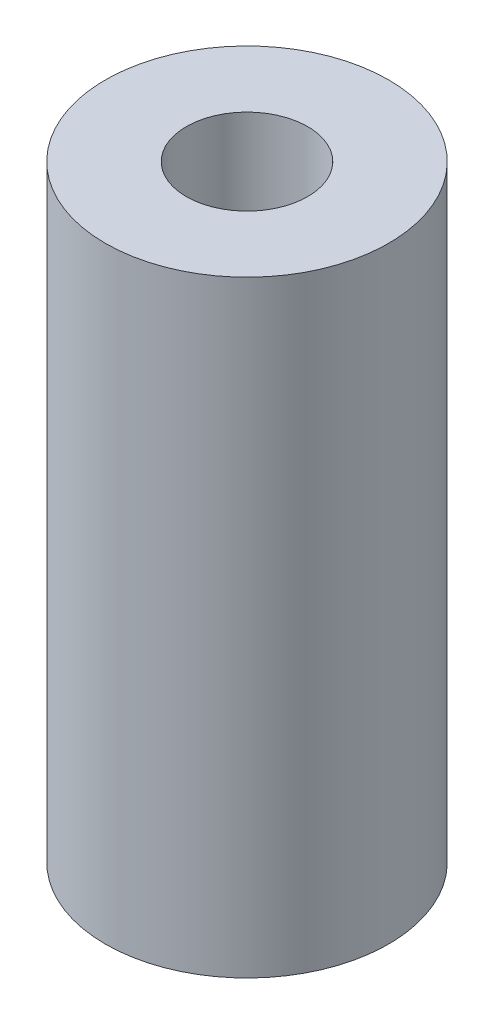
ISO-10303-21;
HEADER;
FILE_DESCRIPTION(('STEP AP214'),'2;1');
FILE_NAME('part.step','',(''),(''),'','','');
FILE_SCHEMA(('AUTOMOTIVE_DESIGN { 1 0 10303 214 1 1 1 1 }'));
ENDSEC;
DATA;
#1=APPLICATION_CONTEXT('core data for automotive mechanical design processes');
#2=APPLICATION_PROTOCOL_DEFINITION('international standard','automotive_design',2000,#1);
#3=PRODUCT_CONTEXT('',#1,'mechanical');
#4=PRODUCT('Part','Part','',(#3));
#5=PRODUCT_RELATED_PRODUCT_CATEGORY('part','',(#4));
#6=PRODUCT_DEFINITION_FORMATION('','',#4);
#7=PRODUCT_DEFINITION_CONTEXT('part definition',#1,'design');
#8=PRODUCT_DEFINITION('design','',#6,#7);
#9=PRODUCT_DEFINITION_SHAPE('','',#8);
#10=(LENGTH_UNIT() NAMED_UNIT(*) SI_UNIT(.MILLI.,.METRE.));
#11=(NAMED_UNIT(*) PLANE_ANGLE_UNIT() SI_UNIT($,.RADIAN.));
#12=(NAMED_UNIT(*) SI_UNIT($,.STERADIAN.) SOLID_ANGLE_UNIT());
#13=UNCERTAINTY_MEASURE_WITH_UNIT(LENGTH_MEASURE(1.E-05),#10,'distance_accuracy_value','');
#14=(GEOMETRIC_REPRESENTATION_CONTEXT(3) GLOBAL_UNCERTAINTY_ASSIGNED_CONTEXT((#13)) GLOBAL_UNIT_ASSIGNED_CONTEXT((#10,
#11,#12)) REPRESENTATION_CONTEXT('',''));
#15=CARTESIAN_POINT('',(0.,0.,0.));
#16=DIRECTION('',(0.,0.,1.));
#17=DIRECTION('',(1.,0.,0.));
#18=AXIS2_PLACEMENT_3D('',#15,#16,#17);
#19=CARTESIAN_POINT('',(0.,15.,0.));
#20=DIRECTION('',(0.,1.,0.));
#21=DIRECTION('',(0.,0.,1.));
#22=AXIS2_PLACEMENT_3D('',#19,#20,#21);
#23=PLANE('',#22);
#24=CARTESIAN_POINT('',(0.,15.,0.));
#25=DIRECTION('',(0.,1.,0.));
#26=DIRECTION('',(0.,0.,1.));
#27=AXIS2_PLACEMENT_3D('',#24,#25,#26);
#28=CIRCLE('',#27,3.5);
#29=CARTESIAN_POINT('',(0.,15.,3.5));
#30=VERTEX_POINT('',#29);
#31=EDGE_CURVE('E10',#30,#30,#28,.T.);
#32=ORIENTED_EDGE('',*,*,#31,.T.);
#33=EDGE_LOOP('',(#32));
#34=FACE_BOUND('',#33,.T.);
#35=CARTESIAN_POINT('',(0.,15.,0.));
#36=DIRECTION('',(0.,1.,0.));
#37=DIRECTION('',(0.,0.,1.));
#38=AXIS2_PLACEMENT_3D('',#35,#36,#37);
#39=CIRCLE('',#38,1.5);
#40=CARTESIAN_POINT('',(0.,15.,1.5));
#41=VERTEX_POINT('',#40);
#42=EDGE_CURVE('E42',#41,#41,#39,.T.);
#43=ORIENTED_EDGE('',*,*,#42,.F.);
#44=EDGE_LOOP('',(#43));
#45=FACE_BOUND('',#44,.T.);
#46=ADVANCED_FACE('F31',(#34,#45),#23,.T.);
#47=CARTESIAN_POINT('',(0.,0.,0.));
#48=DIRECTION('',(0.,1.,0.));
#49=DIRECTION('',(0.,0.,1.));
#50=AXIS2_PLACEMENT_3D('',#47,#48,#49);
#51=PLANE('',#50);
#52=CARTESIAN_POINT('',(0.,0.,0.));
#53=DIRECTION('',(0.,1.,0.));
#54=DIRECTION('',(0.,0.,1.));
#55=AXIS2_PLACEMENT_3D('',#52,#53,#54);
#56=CIRCLE('',#55,3.5);
#57=CARTESIAN_POINT('',(0.,0.,3.5));
#58=VERTEX_POINT('',#57);
#59=EDGE_CURVE('E35',#58,#58,#56,.T.);
#60=ORIENTED_EDGE('',*,*,#59,.F.);
#61=EDGE_LOOP('',(#60));
#62=FACE_BOUND('',#61,.T.);
#63=CARTESIAN_POINT('',(0.,0.,0.));
#64=DIRECTION('',(0.,1.,0.));
#65=DIRECTION('',(0.,0.,1.));
#66=AXIS2_PLACEMENT_3D('',#63,#64,#65);
#67=CIRCLE('',#66,1.5);
#68=CARTESIAN_POINT('',(0.,0.,1.5));
#69=VERTEX_POINT('',#68);
#70=EDGE_CURVE('E44',#69,#69,#67,.T.);
#71=ORIENTED_EDGE('',*,*,#70,.T.);
#72=EDGE_LOOP('',(#71));
#73=FACE_BOUND('',#72,.T.);
#74=ADVANCED_FACE('F54',(#62,#73),#51,.F.);
#75=CARTESIAN_POINT('',(0.,15.,0.));
#76=DIRECTION('',(0.,-1.,0.));
#77=DIRECTION('',(0.,0.,-1.));
#78=AXIS2_PLACEMENT_3D('',#75,#76,#77);
#79=CYLINDRICAL_SURFACE('',#78,3.5);
#80=ORIENTED_EDGE('',*,*,#31,.F.);
#81=EDGE_LOOP('',(#80));
#82=FACE_BOUND('',#81,.T.);
#83=ORIENTED_EDGE('',*,*,#59,.T.);
#84=EDGE_LOOP('',(#83));
#85=FACE_BOUND('',#84,.T.);
#86=ADVANCED_FACE('F33',(#82,#85),#79,.T.);
#87=CARTESIAN_POINT('',(0.,15.,0.));
#88=DIRECTION('',(0.,-1.,0.));
#89=DIRECTION('',(0.,0.,-1.));
#90=AXIS2_PLACEMENT_3D('',#87,#88,#89);
#91=CYLINDRICAL_SURFACE('',#90,1.5);
#92=ORIENTED_EDGE('',*,*,#42,.T.);
#93=EDGE_LOOP('',(#92));
#94=FACE_BOUND('',#93,.T.);
#95=ORIENTED_EDGE('',*,*,#70,.F.);
#96=EDGE_LOOP('',(#95));
#97=FACE_BOUND('',#96,.T.);
#98=ADVANCED_FACE('F50',(#94,#97),#91,.F.);
#99=CLOSED_SHELL('',(#46,#74,#86,#98));
#100=MANIFOLD_SOLID_BREP('B2',#99);
#101=ADVANCED_BREP_SHAPE_REPRESENTATION('',(#18,#100),#14);
#102=SHAPE_DEFINITION_REPRESENTATION(#9,#101);
ENDSEC;
END-ISO-10303-21;
